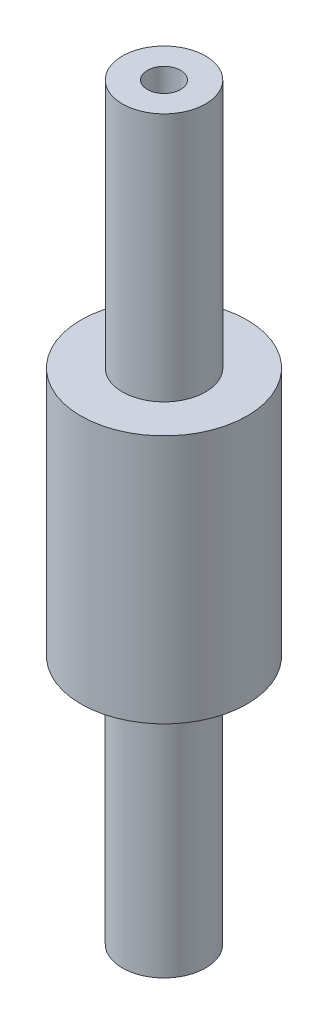
ISO-10303-21;
HEADER;
FILE_DESCRIPTION(('STEP AP214'),'2;1');
FILE_NAME('part.step','',(''),(''),'','','');
FILE_SCHEMA(('AUTOMOTIVE_DESIGN { 1 0 10303 214 1 1 1 1 }'));
ENDSEC;
DATA;
#1=APPLICATION_CONTEXT('core data for automotive mechanical design processes');
#2=APPLICATION_PROTOCOL_DEFINITION('international standard','automotive_design',2000,#1);
#3=PRODUCT_CONTEXT('',#1,'mechanical');
#4=PRODUCT('Part','Part','',(#3));
#5=PRODUCT_RELATED_PRODUCT_CATEGORY('part','',(#4));
#6=PRODUCT_DEFINITION_FORMATION('','',#4);
#7=PRODUCT_DEFINITION_CONTEXT('part definition',#1,'design');
#8=PRODUCT_DEFINITION('design','',#6,#7);
#9=PRODUCT_DEFINITION_SHAPE('','',#8);
#10=(LENGTH_UNIT() NAMED_UNIT(*) SI_UNIT(.MILLI.,.METRE.));
#11=(NAMED_UNIT(*) PLANE_ANGLE_UNIT() SI_UNIT($,.RADIAN.));
#12=(NAMED_UNIT(*) SI_UNIT($,.STERADIAN.) SOLID_ANGLE_UNIT());
#13=UNCERTAINTY_MEASURE_WITH_UNIT(LENGTH_MEASURE(1.E-05),#10,'distance_accuracy_value','');
#14=(GEOMETRIC_REPRESENTATION_CONTEXT(3) GLOBAL_UNCERTAINTY_ASSIGNED_CONTEXT((#13)) GLOBAL_UNIT_ASSIGNED_CONTEXT((#10,
#11,#12)) REPRESENTATION_CONTEXT('',''));
#15=CARTESIAN_POINT('',(0.,0.,0.));
#16=DIRECTION('',(0.,0.,1.));
#17=DIRECTION('',(1.,0.,0.));
#18=AXIS2_PLACEMENT_3D('',#15,#16,#17);
#19=CARTESIAN_POINT('',(0.,30.,0.));
#20=DIRECTION('',(0.,-1.,0.));
#21=DIRECTION('',(0.,0.,-1.));
#22=AXIS2_PLACEMENT_3D('',#19,#20,#21);
#23=CYLINDRICAL_SURFACE('',#22,10.);
#24=CARTESIAN_POINT('',(0.,30.,0.));
#25=DIRECTION('',(0.,1.,0.));
#26=DIRECTION('',(0.,0.,1.));
#27=AXIS2_PLACEMENT_3D('',#24,#25,#26);
#28=CIRCLE('',#27,10.);
#29=CARTESIAN_POINT('',(0.,30.,10.));
#30=VERTEX_POINT('',#29);
#31=EDGE_CURVE('E46',#30,#30,#28,.T.);
#32=ORIENTED_EDGE('',*,*,#31,.F.);
#33=EDGE_LOOP('',(#32));
#34=FACE_BOUND('',#33,.T.);
#35=CARTESIAN_POINT('',(0.,0.,0.));
#36=DIRECTION('',(0.,1.,0.));
#37=DIRECTION('',(0.,0.,1.));
#38=AXIS2_PLACEMENT_3D('',#35,#36,#37);
#39=CIRCLE('',#38,10.);
#40=CARTESIAN_POINT('',(0.,0.,10.));
#41=VERTEX_POINT('',#40);
#42=EDGE_CURVE('E37',#41,#41,#39,.T.);
#43=ORIENTED_EDGE('',*,*,#42,.T.);
#44=EDGE_LOOP('',(#43));
#45=FACE_BOUND('',#44,.T.);
#46=ADVANCED_FACE('F34',(#34,#45),#23,.T.);
#47=CARTESIAN_POINT('',(0.,30.,0.));
#48=DIRECTION('',(0.,1.,0.));
#49=DIRECTION('',(0.,0.,1.));
#50=AXIS2_PLACEMENT_3D('',#47,#48,#49);
#51=PLANE('',#50);
#52=CARTESIAN_POINT('',(0.,30.,0.));
#53=DIRECTION('',(0.,1.,0.));
#54=DIRECTION('',(0.,0.,1.));
#55=AXIS2_PLACEMENT_3D('',#52,#53,#54);
#56=CIRCLE('',#55,5.);
#57=CARTESIAN_POINT('',(0.,30.,5.));
#58=VERTEX_POINT('',#57);
#59=EDGE_CURVE('E41',#58,#58,#56,.T.);
#60=ORIENTED_EDGE('',*,*,#59,.F.);
#61=EDGE_LOOP('',(#60));
#62=FACE_BOUND('',#61,.T.);
#63=ORIENTED_EDGE('',*,*,#31,.T.);
#64=EDGE_LOOP('',(#63));
#65=FACE_BOUND('',#64,.T.);
#66=ADVANCED_FACE('F64',(#62,#65),#51,.T.);
#67=CARTESIAN_POINT('',(0.,0.,0.));
#68=DIRECTION('',(0.,1.,0.));
#69=DIRECTION('',(0.,0.,1.));
#70=AXIS2_PLACEMENT_3D('',#67,#68,#69);
#71=PLANE('',#70);
#72=CARTESIAN_POINT('',(0.,0.,0.));
#73=DIRECTION('',(0.,-1.,0.));
#74=DIRECTION('',(0.,0.,-1.));
#75=AXIS2_PLACEMENT_3D('',#72,#73,#74);
#76=CIRCLE('',#75,5.);
#77=CARTESIAN_POINT('',(0.,0.,-5.));
#78=VERTEX_POINT('',#77);
#79=EDGE_CURVE('E10',#78,#78,#76,.T.);
#80=ORIENTED_EDGE('',*,*,#79,.F.);
#81=EDGE_LOOP('',(#80));
#82=FACE_BOUND('',#81,.T.);
#83=ORIENTED_EDGE('',*,*,#42,.F.);
#84=EDGE_LOOP('',(#83));
#85=FACE_BOUND('',#84,.T.);
#86=ADVANCED_FACE('F61',(#82,#85),#71,.F.);
#87=CARTESIAN_POINT('',(0.,60.,0.));
#88=DIRECTION('',(0.,-1.,0.));
#89=DIRECTION('',(0.,0.,-1.));
#90=AXIS2_PLACEMENT_3D('',#87,#88,#89);
#91=CYLINDRICAL_SURFACE('',#90,5.);
#92=CARTESIAN_POINT('',(0.,60.,0.));
#93=DIRECTION('',(0.,1.,0.));
#94=DIRECTION('',(0.,0.,1.));
#95=AXIS2_PLACEMENT_3D('',#92,#93,#94);
#96=CIRCLE('',#95,5.);
#97=CARTESIAN_POINT('',(0.,60.,5.));
#98=VERTEX_POINT('',#97);
#99=EDGE_CURVE('E52',#98,#98,#96,.T.);
#100=ORIENTED_EDGE('',*,*,#99,.F.);
#101=EDGE_LOOP('',(#100));
#102=FACE_BOUND('',#101,.T.);
#103=ORIENTED_EDGE('',*,*,#59,.T.);
#104=EDGE_LOOP('',(#103));
#105=FACE_BOUND('',#104,.T.);
#106=ADVANCED_FACE('F63',(#102,#105),#91,.T.);
#107=CARTESIAN_POINT('',(0.,60.,0.));
#108=DIRECTION('',(0.,1.,0.));
#109=DIRECTION('',(0.,0.,1.));
#110=AXIS2_PLACEMENT_3D('',#107,#108,#109);
#111=PLANE('',#110);
#112=CARTESIAN_POINT('',(0.,60.,0.));
#113=DIRECTION('',(0.,1.,0.));
#114=DIRECTION('',(0.,0.,1.));
#115=AXIS2_PLACEMENT_3D('',#112,#113,#114);
#116=CIRCLE('',#115,2.);
#117=CARTESIAN_POINT('',(0.,60.,2.));
#118=VERTEX_POINT('',#117);
#119=EDGE_CURVE('E174',#118,#118,#116,.T.);
#120=ORIENTED_EDGE('',*,*,#119,.F.);
#121=EDGE_LOOP('',(#120));
#122=FACE_BOUND('',#121,.T.);
#123=ORIENTED_EDGE('',*,*,#99,.T.);
#124=EDGE_LOOP('',(#123));
#125=FACE_BOUND('',#124,.T.);
#126=ADVANCED_FACE('F70',(#122,#125),#111,.T.);
#127=CARTESIAN_POINT('',(0.,-30.,0.));
#128=DIRECTION('',(0.,1.,0.));
#129=DIRECTION('',(0.,0.,1.));
#130=AXIS2_PLACEMENT_3D('',#127,#128,#129);
#131=CYLINDRICAL_SURFACE('',#130,5.);
#132=CARTESIAN_POINT('',(0.,-30.,0.));
#133=DIRECTION('',(0.,-1.,0.));
#134=DIRECTION('',(0.,0.,-1.));
#135=AXIS2_PLACEMENT_3D('',#132,#133,#134);
#136=CIRCLE('',#135,5.);
#137=CARTESIAN_POINT('',(0.,-30.,-5.));
#138=VERTEX_POINT('',#137);
#139=EDGE_CURVE('E50',#138,#138,#136,.T.);
#140=ORIENTED_EDGE('',*,*,#139,.F.);
#141=EDGE_LOOP('',(#140));
#142=FACE_BOUND('',#141,.T.);
#143=ORIENTED_EDGE('',*,*,#79,.T.);
#144=EDGE_LOOP('',(#143));
#145=FACE_BOUND('',#144,.T.);
#146=ADVANCED_FACE('F98',(#142,#145),#131,.T.);
#147=CARTESIAN_POINT('',(0.,-30.,0.));
#148=DIRECTION('',(0.,-1.,0.));
#149=DIRECTION('',(0.,0.,-1.));
#150=AXIS2_PLACEMENT_3D('',#147,#148,#149);
#151=PLANE('',#150);
#152=CARTESIAN_POINT('',(0.,-30.,0.));
#153=DIRECTION('',(0.,-1.,0.));
#154=DIRECTION('',(0.,0.,-1.));
#155=AXIS2_PLACEMENT_3D('',#152,#153,#154);
#156=CIRCLE('',#155,2.);
#157=CARTESIAN_POINT('',(0.,-30.,-2.));
#158=VERTEX_POINT('',#157);
#159=EDGE_CURVE('E175',#158,#158,#156,.T.);
#160=ORIENTED_EDGE('',*,*,#159,.F.);
#161=EDGE_LOOP('',(#160));
#162=FACE_BOUND('',#161,.T.);
#163=ORIENTED_EDGE('',*,*,#139,.T.);
#164=EDGE_LOOP('',(#163));
#165=FACE_BOUND('',#164,.T.);
#166=ADVANCED_FACE('F104',(#162,#165),#151,.T.);
#167=CARTESIAN_POINT('',(0.,40.,0.));
#168=DIRECTION('',(0.,1.,0.));
#169=DIRECTION('',(0.,0.,1.));
#170=AXIS2_PLACEMENT_3D('',#167,#168,#169);
#171=CYLINDRICAL_SURFACE('',#170,2.);
#172=CARTESIAN_POINT('',(0.,40.,0.));
#173=DIRECTION('',(0.,1.,0.));
#174=DIRECTION('',(0.,0.,1.));
#175=AXIS2_PLACEMENT_3D('',#172,#173,#174);
#176=CIRCLE('',#175,2.);
#177=CARTESIAN_POINT('',(0.,40.,2.));
#178=VERTEX_POINT('',#177);
#179=EDGE_CURVE('E178',#178,#178,#176,.T.);
#180=ORIENTED_EDGE('',*,*,#179,.F.);
#181=EDGE_LOOP('',(#180));
#182=FACE_BOUND('',#181,.T.);
#183=ORIENTED_EDGE('',*,*,#119,.T.);
#184=EDGE_LOOP('',(#183));
#185=FACE_BOUND('',#184,.T.);
#186=ADVANCED_FACE('F122',(#182,#185),#171,.F.);
#187=CARTESIAN_POINT('',(0.,40.,0.));
#188=DIRECTION('',(0.,1.,0.));
#189=DIRECTION('',(0.,0.,1.));
#190=AXIS2_PLACEMENT_3D('',#187,#188,#189);
#191=PLANE('',#190);
#192=ORIENTED_EDGE('',*,*,#179,.T.);
#193=EDGE_LOOP('',(#192));
#194=FACE_BOUND('',#193,.T.);
#195=ADVANCED_FACE('F127',(#194),#191,.T.);
#196=CARTESIAN_POINT('',(0.,-10.,0.));
#197=DIRECTION('',(0.,-1.,0.));
#198=DIRECTION('',(0.,0.,-1.));
#199=AXIS2_PLACEMENT_3D('',#196,#197,#198);
#200=CYLINDRICAL_SURFACE('',#199,2.);
#201=CARTESIAN_POINT('',(0.,-10.,0.));
#202=DIRECTION('',(0.,-1.,0.));
#203=DIRECTION('',(0.,0.,-1.));
#204=AXIS2_PLACEMENT_3D('',#201,#202,#203);
#205=CIRCLE('',#204,2.);
#206=CARTESIAN_POINT('',(0.,-10.,-2.));
#207=VERTEX_POINT('',#206);
#208=EDGE_CURVE('E173',#207,#207,#205,.T.);
#209=ORIENTED_EDGE('',*,*,#208,.F.);
#210=EDGE_LOOP('',(#209));
#211=FACE_BOUND('',#210,.T.);
#212=ORIENTED_EDGE('',*,*,#159,.T.);
#213=EDGE_LOOP('',(#212));
#214=FACE_BOUND('',#213,.T.);
#215=ADVANCED_FACE('F138',(#211,#214),#200,.F.);
#216=CARTESIAN_POINT('',(0.,-10.,0.));
#217=DIRECTION('',(0.,-1.,0.));
#218=DIRECTION('',(0.,0.,-1.));
#219=AXIS2_PLACEMENT_3D('',#216,#217,#218);
#220=PLANE('',#219);
#221=ORIENTED_EDGE('',*,*,#208,.T.);
#222=EDGE_LOOP('',(#221));
#223=FACE_BOUND('',#222,.T.);
#224=ADVANCED_FACE('F156',(#223),#220,.T.);
#225=CLOSED_SHELL('',(#46,#66,#86,#106,#126,#146,#166,#186,#195,#215,#224));
#226=MANIFOLD_SOLID_BREP('B2',#225);
#227=ADVANCED_BREP_SHAPE_REPRESENTATION('',(#18,#226),#14);
#228=SHAPE_DEFINITION_REPRESENTATION(#9,#227);
ENDSEC;
END-ISO-10303-21;
